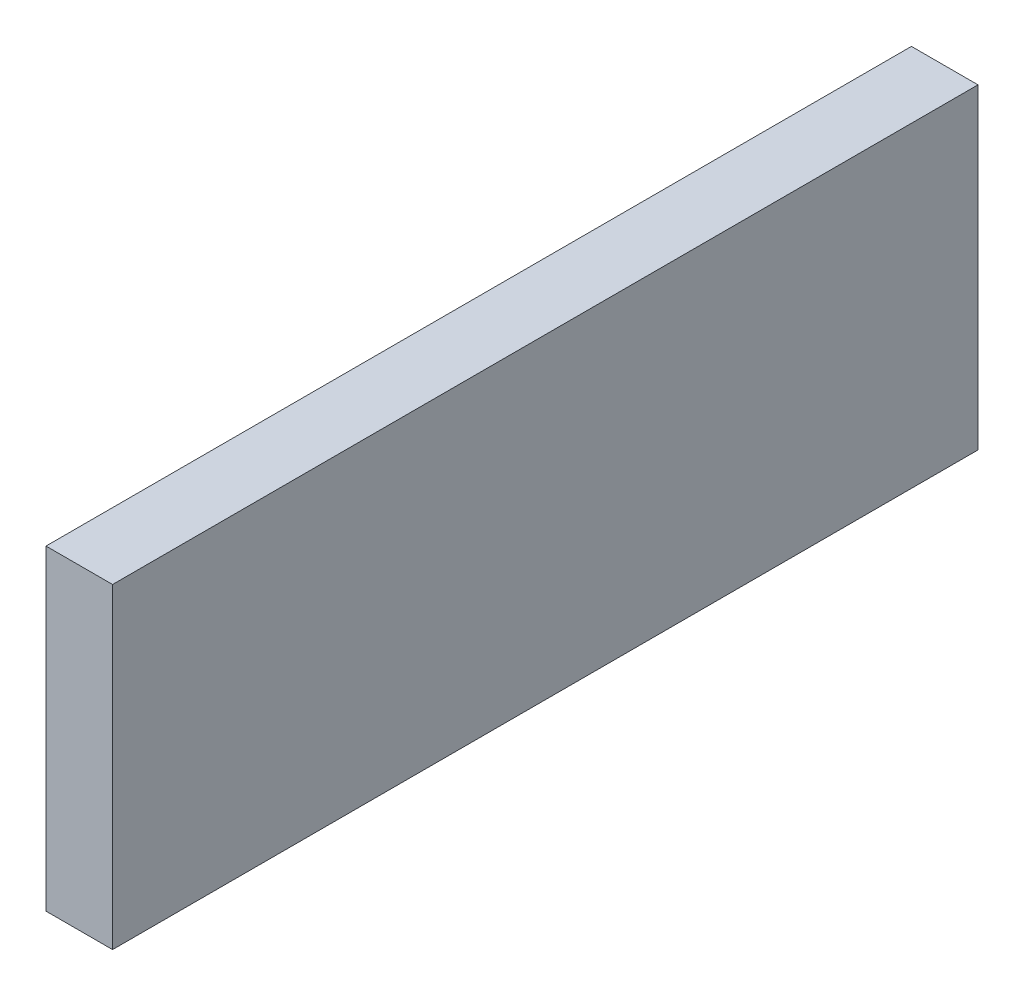
ISO-10303-21;
HEADER;
FILE_DESCRIPTION(('STEP AP214'),'2;1');
FILE_NAME('part.step','',(''),(''),'','','');
FILE_SCHEMA(('AUTOMOTIVE_DESIGN { 1 0 10303 214 1 1 1 1 }'));
ENDSEC;
DATA;
#1=APPLICATION_CONTEXT('core data for automotive mechanical design processes');
#2=APPLICATION_PROTOCOL_DEFINITION('international standard','automotive_design',2000,#1);
#3=PRODUCT_CONTEXT('',#1,'mechanical');
#4=PRODUCT('Part','Part','',(#3));
#5=PRODUCT_RELATED_PRODUCT_CATEGORY('part','',(#4));
#6=PRODUCT_DEFINITION_FORMATION('','',#4);
#7=PRODUCT_DEFINITION_CONTEXT('part definition',#1,'design');
#8=PRODUCT_DEFINITION('design','',#6,#7);
#9=PRODUCT_DEFINITION_SHAPE('','',#8);
#10=(LENGTH_UNIT() NAMED_UNIT(*) SI_UNIT(.MILLI.,.METRE.));
#11=(NAMED_UNIT(*) PLANE_ANGLE_UNIT() SI_UNIT($,.RADIAN.));
#12=(NAMED_UNIT(*) SI_UNIT($,.STERADIAN.) SOLID_ANGLE_UNIT());
#13=UNCERTAINTY_MEASURE_WITH_UNIT(LENGTH_MEASURE(1.E-05),#10,'distance_accuracy_value','');
#14=(GEOMETRIC_REPRESENTATION_CONTEXT(3) GLOBAL_UNCERTAINTY_ASSIGNED_CONTEXT((#13)) GLOBAL_UNIT_ASSIGNED_CONTEXT((#10,
#11,#12)) REPRESENTATION_CONTEXT('',''));
#15=CARTESIAN_POINT('',(0.,0.,0.));
#16=DIRECTION('',(0.,0.,1.));
#17=DIRECTION('',(1.,0.,0.));
#18=AXIS2_PLACEMENT_3D('',#15,#16,#17);
#19=CARTESIAN_POINT('',(-12.7,120.65,-330.2));
#20=DIRECTION('',(-1.,0.,0.));
#21=DIRECTION('',(0.,-1.,0.));
#22=AXIS2_PLACEMENT_3D('',#19,#20,#21);
#23=PLANE('',#22);
#24=DIRECTION('',(0.,-1.,0.));
#25=VECTOR('',#24,1.);
#26=CARTESIAN_POINT('',(-12.7,120.65,0.));
#27=LINE('',#26,#25);
#28=CARTESIAN_POINT('',(-12.7,120.65,0.));
#29=VERTEX_POINT('',#28);
#30=CARTESIAN_POINT('',(-12.7,0.,0.));
#31=VERTEX_POINT('',#30);
#32=EDGE_CURVE('E72',#29,#31,#27,.T.);
#33=ORIENTED_EDGE('',*,*,#32,.F.);
#34=DIRECTION('',(0.,0.,1.));
#35=VECTOR('',#34,1.);
#36=CARTESIAN_POINT('',(-12.7,120.65,-330.2));
#37=LINE('',#36,#35);
#38=CARTESIAN_POINT('',(-12.7,120.65,-330.2));
#39=VERTEX_POINT('',#38);
#40=EDGE_CURVE('E11',#39,#29,#37,.T.);
#41=ORIENTED_EDGE('',*,*,#40,.F.);
#42=DIRECTION('',(0.,-1.,0.));
#43=VECTOR('',#42,1.);
#44=CARTESIAN_POINT('',(-12.7,120.65,-330.2));
#45=LINE('',#44,#43);
#46=CARTESIAN_POINT('',(-12.7,0.,-330.2));
#47=VERTEX_POINT('',#46);
#48=EDGE_CURVE('E74',#39,#47,#45,.T.);
#49=ORIENTED_EDGE('',*,*,#48,.T.);
#50=DIRECTION('',(0.,0.,1.));
#51=VECTOR('',#50,1.);
#52=CARTESIAN_POINT('',(-12.7,0.,-330.2));
#53=LINE('',#52,#51);
#54=EDGE_CURVE('E35',#47,#31,#53,.T.);
#55=ORIENTED_EDGE('',*,*,#54,.T.);
#56=EDGE_LOOP('',(#33,#41,#49,#55));
#57=FACE_BOUND('',#56,.T.);
#58=ADVANCED_FACE('F32',(#57),#23,.T.);
#59=CARTESIAN_POINT('',(-12.7,120.65,-330.2));
#60=DIRECTION('',(0.,1.,0.));
#61=DIRECTION('',(0.,0.,1.));
#62=AXIS2_PLACEMENT_3D('',#59,#60,#61);
#63=PLANE('',#62);
#64=DIRECTION('',(-1.,0.,0.));
#65=VECTOR('',#64,1.);
#66=CARTESIAN_POINT('',(-12.7,120.65,0.));
#67=LINE('',#66,#65);
#68=CARTESIAN_POINT('',(12.7,120.65,0.));
#69=VERTEX_POINT('',#68);
#70=EDGE_CURVE('E89',#69,#29,#67,.T.);
#71=ORIENTED_EDGE('',*,*,#70,.F.);
#72=DIRECTION('',(0.,0.,1.));
#73=VECTOR('',#72,1.);
#74=CARTESIAN_POINT('',(12.7,120.65,-330.2));
#75=LINE('',#74,#73);
#76=CARTESIAN_POINT('',(12.7,120.65,-330.2));
#77=VERTEX_POINT('',#76);
#78=EDGE_CURVE('E40',#77,#69,#75,.T.);
#79=ORIENTED_EDGE('',*,*,#78,.F.);
#80=DIRECTION('',(-1.,0.,0.));
#81=VECTOR('',#80,1.);
#82=CARTESIAN_POINT('',(-12.7,120.65,-330.2));
#83=LINE('',#82,#81);
#84=EDGE_CURVE('E79',#77,#39,#83,.T.);
#85=ORIENTED_EDGE('',*,*,#84,.T.);
#86=ORIENTED_EDGE('',*,*,#40,.T.);
#87=EDGE_LOOP('',(#71,#79,#85,#86));
#88=FACE_BOUND('',#87,.T.);
#89=ADVANCED_FACE('F104',(#88),#63,.T.);
#90=CARTESIAN_POINT('',(12.7,120.65,-330.2));
#91=DIRECTION('',(1.,0.,0.));
#92=DIRECTION('',(0.,1.,0.));
#93=AXIS2_PLACEMENT_3D('',#90,#91,#92);
#94=PLANE('',#93);
#95=DIRECTION('',(0.,1.,0.));
#96=VECTOR('',#95,1.);
#97=CARTESIAN_POINT('',(12.7,120.65,0.));
#98=LINE('',#97,#96);
#99=CARTESIAN_POINT('',(12.7,0.,0.));
#100=VERTEX_POINT('',#99);
#101=EDGE_CURVE('E86',#100,#69,#98,.T.);
#102=ORIENTED_EDGE('',*,*,#101,.F.);
#103=DIRECTION('',(0.,0.,1.));
#104=VECTOR('',#103,1.);
#105=CARTESIAN_POINT('',(12.7,0.,-330.2));
#106=LINE('',#105,#104);
#107=CARTESIAN_POINT('',(12.7,0.,-330.2));
#108=VERTEX_POINT('',#107);
#109=EDGE_CURVE('E78',#108,#100,#106,.T.);
#110=ORIENTED_EDGE('',*,*,#109,.F.);
#111=DIRECTION('',(0.,1.,0.));
#112=VECTOR('',#111,1.);
#113=CARTESIAN_POINT('',(12.7,120.65,-330.2));
#114=LINE('',#113,#112);
#115=EDGE_CURVE('E97',#108,#77,#114,.T.);
#116=ORIENTED_EDGE('',*,*,#115,.T.);
#117=ORIENTED_EDGE('',*,*,#78,.T.);
#118=EDGE_LOOP('',(#102,#110,#116,#117));
#119=FACE_BOUND('',#118,.T.);
#120=ADVANCED_FACE('F101',(#119),#94,.T.);
#121=CARTESIAN_POINT('',(-12.7,0.,-330.2));
#122=DIRECTION('',(0.,-1.,0.));
#123=DIRECTION('',(0.,0.,-1.));
#124=AXIS2_PLACEMENT_3D('',#121,#122,#123);
#125=PLANE('',#124);
#126=DIRECTION('',(1.,0.,0.));
#127=VECTOR('',#126,1.);
#128=CARTESIAN_POINT('',(-12.7,0.,0.));
#129=LINE('',#128,#127);
#130=EDGE_CURVE('E81',#31,#100,#129,.T.);
#131=ORIENTED_EDGE('',*,*,#130,.F.);
#132=ORIENTED_EDGE('',*,*,#54,.F.);
#133=DIRECTION('',(1.,0.,0.));
#134=VECTOR('',#133,1.);
#135=CARTESIAN_POINT('',(-12.7,0.,-330.2));
#136=LINE('',#135,#134);
#137=EDGE_CURVE('E95',#47,#108,#136,.T.);
#138=ORIENTED_EDGE('',*,*,#137,.T.);
#139=ORIENTED_EDGE('',*,*,#109,.T.);
#140=EDGE_LOOP('',(#131,#132,#138,#139));
#141=FACE_BOUND('',#140,.T.);
#142=ADVANCED_FACE('F82',(#141),#125,.T.);
#143=CARTESIAN_POINT('',(-12.7,0.,-330.2));
#144=DIRECTION('',(0.,0.,1.));
#145=DIRECTION('',(1.,0.,0.));
#146=AXIS2_PLACEMENT_3D('',#143,#144,#145);
#147=PLANE('',#146);
#148=ORIENTED_EDGE('',*,*,#48,.F.);
#149=ORIENTED_EDGE('',*,*,#84,.F.);
#150=ORIENTED_EDGE('',*,*,#115,.F.);
#151=ORIENTED_EDGE('',*,*,#137,.F.);
#152=EDGE_LOOP('',(#148,#149,#150,#151));
#153=FACE_BOUND('',#152,.T.);
#154=ADVANCED_FACE('F106',(#153),#147,.F.);
#155=CARTESIAN_POINT('',(-12.7,0.,0.));
#156=DIRECTION('',(0.,0.,1.));
#157=DIRECTION('',(1.,0.,0.));
#158=AXIS2_PLACEMENT_3D('',#155,#156,#157);
#159=PLANE('',#158);
#160=ORIENTED_EDGE('',*,*,#32,.T.);
#161=ORIENTED_EDGE('',*,*,#130,.T.);
#162=ORIENTED_EDGE('',*,*,#101,.T.);
#163=ORIENTED_EDGE('',*,*,#70,.T.);
#164=EDGE_LOOP('',(#160,#161,#162,#163));
#165=FACE_BOUND('',#164,.T.);
#166=ADVANCED_FACE('F88',(#165),#159,.T.);
#167=CLOSED_SHELL('',(#58,#89,#120,#142,#154,#166));
#168=MANIFOLD_SOLID_BREP('B2',#167);
#169=ADVANCED_BREP_SHAPE_REPRESENTATION('',(#18,#168),#14);
#170=SHAPE_DEFINITION_REPRESENTATION(#9,#169);
ENDSEC;
END-ISO-10303-21;
